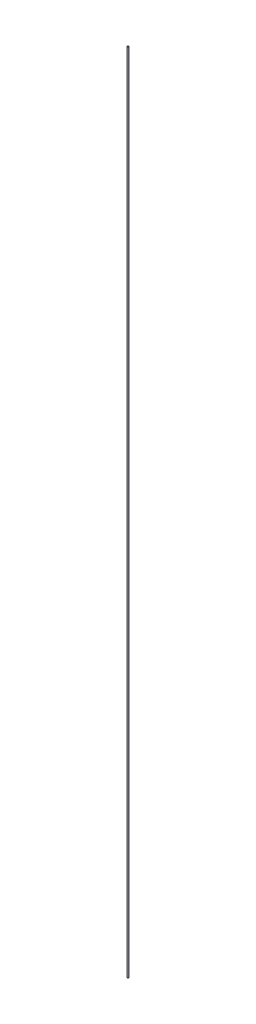
ISO-10303-21;
HEADER;
FILE_DESCRIPTION(('STEP AP214'),'2;1');
FILE_NAME('part.step','',(''),(''),'','','');
FILE_SCHEMA(('AUTOMOTIVE_DESIGN { 1 0 10303 214 1 1 1 1 }'));
ENDSEC;
DATA;
#1=APPLICATION_CONTEXT('core data for automotive mechanical design processes');
#2=APPLICATION_PROTOCOL_DEFINITION('international standard','automotive_design',2000,#1);
#3=PRODUCT_CONTEXT('',#1,'mechanical');
#4=PRODUCT('Part','Part','',(#3));
#5=PRODUCT_RELATED_PRODUCT_CATEGORY('part','',(#4));
#6=PRODUCT_DEFINITION_FORMATION('','',#4);
#7=PRODUCT_DEFINITION_CONTEXT('part definition',#1,'design');
#8=PRODUCT_DEFINITION('design','',#6,#7);
#9=PRODUCT_DEFINITION_SHAPE('','',#8);
#10=(LENGTH_UNIT() NAMED_UNIT(*) SI_UNIT(.MILLI.,.METRE.));
#11=(NAMED_UNIT(*) PLANE_ANGLE_UNIT() SI_UNIT($,.RADIAN.));
#12=(NAMED_UNIT(*) SI_UNIT($,.STERADIAN.) SOLID_ANGLE_UNIT());
#13=UNCERTAINTY_MEASURE_WITH_UNIT(LENGTH_MEASURE(1.E-05),#10,'distance_accuracy_value','');
#14=(GEOMETRIC_REPRESENTATION_CONTEXT(3) GLOBAL_UNCERTAINTY_ASSIGNED_CONTEXT((#13)) GLOBAL_UNIT_ASSIGNED_CONTEXT((#10,
#11,#12)) REPRESENTATION_CONTEXT('',''));
#15=CARTESIAN_POINT('',(0.,0.,0.));
#16=DIRECTION('',(0.,0.,1.));
#17=DIRECTION('',(1.,0.,0.));
#18=AXIS2_PLACEMENT_3D('',#15,#16,#17);
#19=CARTESIAN_POINT('',(0.,0.,0.));
#20=DIRECTION('',(0.,1.,0.));
#21=DIRECTION('',(0.,0.,1.));
#22=AXIS2_PLACEMENT_3D('',#19,#20,#21);
#23=PLANE('',#22);
#24=CARTESIAN_POINT('',(0.,0.,0.));
#25=DIRECTION('',(0.,1.,0.));
#26=DIRECTION('',(0.,0.,1.));
#27=AXIS2_PLACEMENT_3D('',#24,#25,#26);
#28=CIRCLE('',#27,6.35);
#29=CARTESIAN_POINT('',(0.,0.,6.35));
#30=VERTEX_POINT('',#29);
#31=EDGE_CURVE('E46',#30,#30,#28,.T.);
#32=ORIENTED_EDGE('',*,*,#31,.F.);
#33=EDGE_LOOP('',(#32));
#34=FACE_BOUND('',#33,.T.);
#35=ADVANCED_FACE('F40',(#34),#23,.F.);
#36=CARTESIAN_POINT('',(0.,8304.784,0.));
#37=DIRECTION('',(0.,1.,0.));
#38=DIRECTION('',(0.,0.,1.));
#39=AXIS2_PLACEMENT_3D('',#36,#37,#38);
#40=PLANE('',#39);
#41=CARTESIAN_POINT('',(0.,8304.784,0.));
#42=DIRECTION('',(0.,1.,0.));
#43=DIRECTION('',(0.,0.,1.));
#44=AXIS2_PLACEMENT_3D('',#41,#42,#43);
#45=CIRCLE('',#44,6.35);
#46=CARTESIAN_POINT('',(0.,8304.784,6.35));
#47=VERTEX_POINT('',#46);
#48=EDGE_CURVE('E11',#47,#47,#45,.T.);
#49=ORIENTED_EDGE('',*,*,#48,.T.);
#50=EDGE_LOOP('',(#49));
#51=FACE_BOUND('',#50,.T.);
#52=ADVANCED_FACE('F55',(#51),#40,.T.);
#53=CARTESIAN_POINT('',(0.,0.,0.));
#54=DIRECTION('',(0.,1.,0.));
#55=DIRECTION('',(0.,0.,1.));
#56=AXIS2_PLACEMENT_3D('',#53,#54,#55);
#57=CYLINDRICAL_SURFACE('',#56,6.35);
#58=ORIENTED_EDGE('',*,*,#48,.F.);
#59=EDGE_LOOP('',(#58));
#60=FACE_BOUND('',#59,.T.);
#61=ORIENTED_EDGE('',*,*,#31,.T.);
#62=EDGE_LOOP('',(#61));
#63=FACE_BOUND('',#62,.T.);
#64=ADVANCED_FACE('F52',(#60,#63),#57,.T.);
#65=CLOSED_SHELL('',(#35,#52,#64));
#66=MANIFOLD_SOLID_BREP('B2',#65);
#67=ADVANCED_BREP_SHAPE_REPRESENTATION('',(#18,#66),#14);
#68=SHAPE_DEFINITION_REPRESENTATION(#9,#67);
ENDSEC;
END-ISO-10303-21;
